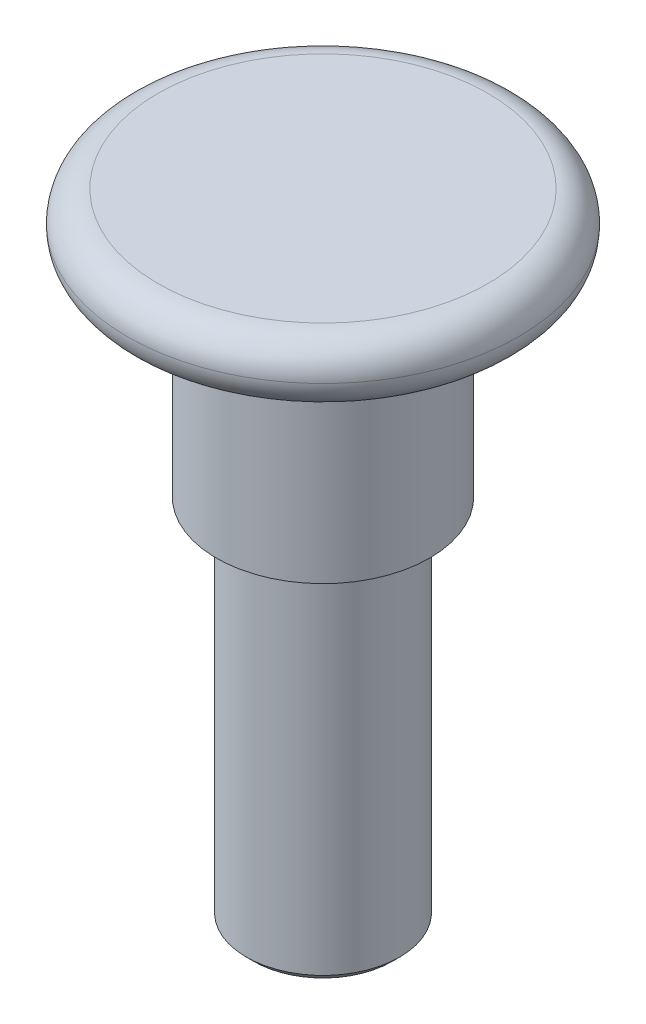
ISO-10303-21;
HEADER;
FILE_DESCRIPTION(('STEP AP214'),'2;1');
FILE_NAME('part.step','',(''),(''),'','','');
FILE_SCHEMA(('AUTOMOTIVE_DESIGN { 1 0 10303 214 1 1 1 1 }'));
ENDSEC;
DATA;
#1=APPLICATION_CONTEXT('core data for automotive mechanical design processes');
#2=APPLICATION_PROTOCOL_DEFINITION('international standard','automotive_design',2000,#1);
#3=PRODUCT_CONTEXT('',#1,'mechanical');
#4=PRODUCT('Part','Part','',(#3));
#5=PRODUCT_RELATED_PRODUCT_CATEGORY('part','',(#4));
#6=PRODUCT_DEFINITION_FORMATION('','',#4);
#7=PRODUCT_DEFINITION_CONTEXT('part definition',#1,'design');
#8=PRODUCT_DEFINITION('design','',#6,#7);
#9=PRODUCT_DEFINITION_SHAPE('','',#8);
#10=(LENGTH_UNIT() NAMED_UNIT(*) SI_UNIT(.MILLI.,.METRE.));
#11=(NAMED_UNIT(*) PLANE_ANGLE_UNIT() SI_UNIT($,.RADIAN.));
#12=(NAMED_UNIT(*) SI_UNIT($,.STERADIAN.) SOLID_ANGLE_UNIT());
#13=UNCERTAINTY_MEASURE_WITH_UNIT(LENGTH_MEASURE(1.E-05),#10,'distance_accuracy_value','');
#14=(GEOMETRIC_REPRESENTATION_CONTEXT(3) GLOBAL_UNCERTAINTY_ASSIGNED_CONTEXT((#13)) GLOBAL_UNIT_ASSIGNED_CONTEXT((#10,
#11,#12)) REPRESENTATION_CONTEXT('',''));
#15=CARTESIAN_POINT('',(0.,0.,0.));
#16=DIRECTION('',(0.,0.,1.));
#17=DIRECTION('',(1.,0.,0.));
#18=AXIS2_PLACEMENT_3D('',#15,#16,#17);
#19=CARTESIAN_POINT('',(0.,61.8362126245847,0.));
#20=DIRECTION('',(0.,1.,0.));
#21=DIRECTION('',(-1.,0.,0.));
#22=AXIS2_PLACEMENT_3D('',#19,#20,#21);
#23=PLANE('',#22);
#24=CARTESIAN_POINT('',(0.,61.8362126245847,0.));
#25=DIRECTION('',(0.,1.,0.));
#26=DIRECTION('',(-1.,0.,0.));
#27=AXIS2_PLACEMENT_3D('',#24,#25,#26);
#28=CIRCLE('',#27,10.75);
#29=CARTESIAN_POINT('',(-10.75,61.8362126245847,0.));
#30=VERTEX_POINT('',#29);
#31=EDGE_CURVE('E85',#30,#30,#28,.T.);
#32=ORIENTED_EDGE('',*,*,#31,.T.);
#33=EDGE_LOOP('',(#32));
#34=FACE_BOUND('',#33,.T.);
#35=ADVANCED_FACE('F33',(#34),#23,.T.);
#36=CARTESIAN_POINT('',(6.94999999999998,57.8362126245847,0.));
#37=DIRECTION('',(0.,-1.,0.));
#38=DIRECTION('',(1.,0.,0.));
#39=AXIS2_PLACEMENT_3D('',#36,#37,#38);
#40=PLANE('',#39);
#41=CARTESIAN_POINT('',(0.,57.8362126245847,0.));
#42=DIRECTION('',(0.,-1.,0.));
#43=DIRECTION('',(1.,0.,0.));
#44=AXIS2_PLACEMENT_3D('',#41,#42,#43);
#45=CIRCLE('',#44,10.75);
#46=CARTESIAN_POINT('',(10.75,57.8362126245847,0.));
#47=VERTEX_POINT('',#46);
#48=EDGE_CURVE('E84',#47,#47,#45,.T.);
#49=ORIENTED_EDGE('',*,*,#48,.T.);
#50=EDGE_LOOP('',(#49));
#51=FACE_BOUND('',#50,.T.);
#52=CARTESIAN_POINT('',(0.,57.8362126245847,0.));
#53=DIRECTION('',(0.,-1.,0.));
#54=DIRECTION('',(1.,0.,0.));
#55=AXIS2_PLACEMENT_3D('',#52,#53,#54);
#56=CIRCLE('',#55,6.94999999999998);
#57=CARTESIAN_POINT('',(6.94999999999998,57.8362126245847,0.));
#58=VERTEX_POINT('',#57);
#59=EDGE_CURVE('E86',#58,#58,#56,.T.);
#60=ORIENTED_EDGE('',*,*,#59,.F.);
#61=EDGE_LOOP('',(#60));
#62=FACE_BOUND('',#61,.T.);
#63=ADVANCED_FACE('F60',(#51,#62),#40,.T.);
#64=CARTESIAN_POINT('',(0.,-52.7197674418605,0.));
#65=DIRECTION('',(0.,-1.,0.));
#66=DIRECTION('',(1.,0.,0.));
#67=AXIS2_PLACEMENT_3D('',#64,#65,#66);
#68=CYLINDRICAL_SURFACE('',#67,6.94999999999998);
#69=ORIENTED_EDGE('',*,*,#59,.T.);
#70=EDGE_LOOP('',(#69));
#71=FACE_BOUND('',#70,.T.);
#72=CARTESIAN_POINT('',(0.,44.4362126245847,0.));
#73=DIRECTION('',(0.,-1.,0.));
#74=DIRECTION('',(1.,0.,0.));
#75=AXIS2_PLACEMENT_3D('',#72,#73,#74);
#76=CIRCLE('',#75,6.94999999999998);
#77=CARTESIAN_POINT('',(6.94999999999998,44.4362126245847,0.));
#78=VERTEX_POINT('',#77);
#79=EDGE_CURVE('E90',#78,#78,#76,.T.);
#80=ORIENTED_EDGE('',*,*,#79,.F.);
#81=EDGE_LOOP('',(#80));
#82=FACE_BOUND('',#81,.T.);
#83=ADVANCED_FACE('F66',(#71,#82),#68,.T.);
#84=CARTESIAN_POINT('',(6.94999999999998,44.4362126245847,0.));
#85=DIRECTION('',(0.,-1.,0.));
#86=DIRECTION('',(1.,0.,0.));
#87=AXIS2_PLACEMENT_3D('',#84,#85,#86);
#88=PLANE('',#87);
#89=ORIENTED_EDGE('',*,*,#79,.T.);
#90=EDGE_LOOP('',(#89));
#91=FACE_BOUND('',#90,.T.);
#92=CARTESIAN_POINT('',(0.,44.4362126245847,0.));
#93=DIRECTION('',(0.,-1.,0.));
#94=DIRECTION('',(1.,0.,0.));
#95=AXIS2_PLACEMENT_3D('',#92,#93,#94);
#96=CIRCLE('',#95,4.99999999999996);
#97=CARTESIAN_POINT('',(4.99999999999996,44.4362126245847,0.));
#98=VERTEX_POINT('',#97);
#99=EDGE_CURVE('E106',#98,#98,#96,.T.);
#100=ORIENTED_EDGE('',*,*,#99,.F.);
#101=EDGE_LOOP('',(#100));
#102=FACE_BOUND('',#101,.T.);
#103=ADVANCED_FACE('F114',(#91,#102),#88,.T.);
#104=CARTESIAN_POINT('',(0.,-52.7197674418605,0.));
#105=DIRECTION('',(0.,-1.,0.));
#106=DIRECTION('',(1.,0.,0.));
#107=AXIS2_PLACEMENT_3D('',#104,#105,#106);
#108=CYLINDRICAL_SURFACE('',#107,4.99999999999997);
#109=CARTESIAN_POINT('',(0.,20.9362126245847,0.));
#110=DIRECTION('',(0.,-1.,0.));
#111=DIRECTION('',(1.,0.,0.));
#112=AXIS2_PLACEMENT_3D('',#109,#110,#111);
#113=CIRCLE('',#112,4.99999999999997);
#114=CARTESIAN_POINT('',(4.99999999999997,20.9362126245847,0.));
#115=VERTEX_POINT('',#114);
#116=EDGE_CURVE('E11',#115,#115,#113,.F.);
#117=ORIENTED_EDGE('',*,*,#116,.T.);
#118=EDGE_LOOP('',(#117));
#119=FACE_BOUND('',#118,.T.);
#120=ORIENTED_EDGE('',*,*,#99,.T.);
#121=EDGE_LOOP('',(#120));
#122=FACE_BOUND('',#121,.T.);
#123=ADVANCED_FACE('F101',(#119,#122),#108,.T.);
#124=CARTESIAN_POINT('',(4.99999999999997,20.4362126245847,0.));
#125=DIRECTION('',(0.,-1.,0.));
#126=DIRECTION('',(1.,0.,0.));
#127=AXIS2_PLACEMENT_3D('',#124,#125,#126);
#128=PLANE('',#127);
#129=CARTESIAN_POINT('',(0.,20.4362126245847,0.));
#130=DIRECTION('',(0.,-1.,0.));
#131=DIRECTION('',(1.,0.,0.));
#132=AXIS2_PLACEMENT_3D('',#129,#130,#131);
#133=CIRCLE('',#132,4.49999999999996);
#134=CARTESIAN_POINT('',(4.49999999999996,20.4362126245847,0.));
#135=VERTEX_POINT('',#134);
#136=EDGE_CURVE('E40',#135,#135,#133,.T.);
#137=ORIENTED_EDGE('',*,*,#136,.T.);
#138=EDGE_LOOP('',(#137));
#139=FACE_BOUND('',#138,.T.);
#140=CARTESIAN_POINT('',(0.,20.4362126245847,0.));
#141=DIRECTION('',(0.,-1.,0.));
#142=DIRECTION('',(1.,0.,0.));
#143=AXIS2_PLACEMENT_3D('',#140,#141,#142);
#144=CIRCLE('',#143,1.99999999999999);
#145=CARTESIAN_POINT('',(1.99999999999999,20.4362126245847,0.));
#146=VERTEX_POINT('',#145);
#147=EDGE_CURVE('E105',#146,#146,#144,.T.);
#148=ORIENTED_EDGE('',*,*,#147,.F.);
#149=EDGE_LOOP('',(#148));
#150=FACE_BOUND('',#149,.T.);
#151=ADVANCED_FACE('F55',(#139,#150),#128,.T.);
#152=CARTESIAN_POINT('',(0.,-52.7197674418605,0.));
#153=DIRECTION('',(0.,-1.,0.));
#154=DIRECTION('',(1.,0.,0.));
#155=AXIS2_PLACEMENT_3D('',#152,#153,#154);
#156=CYLINDRICAL_SURFACE('',#155,1.99999999999999);
#157=ORIENTED_EDGE('',*,*,#147,.T.);
#158=EDGE_LOOP('',(#157));
#159=FACE_BOUND('',#158,.T.);
#160=CARTESIAN_POINT('',(0.,29.4362126245847,0.));
#161=DIRECTION('',(0.,-1.,0.));
#162=DIRECTION('',(1.,0.,0.));
#163=AXIS2_PLACEMENT_3D('',#160,#161,#162);
#164=CIRCLE('',#163,1.99999999999999);
#165=CARTESIAN_POINT('',(1.99999999999999,29.4362126245847,0.));
#166=VERTEX_POINT('',#165);
#167=EDGE_CURVE('E94',#166,#166,#164,.T.);
#168=ORIENTED_EDGE('',*,*,#167,.F.);
#169=EDGE_LOOP('',(#168));
#170=FACE_BOUND('',#169,.T.);
#171=ADVANCED_FACE('F46',(#159,#170),#156,.F.);
#172=CARTESIAN_POINT('',(0.,30.6862126245847,0.));
#173=DIRECTION('',(0.,-1.,0.));
#174=DIRECTION('',(1.,0.,0.));
#175=AXIS2_PLACEMENT_3D('',#172,#173,#174);
#176=CONICAL_SURFACE('',#175,0.,1.01219701145133);
#177=ORIENTED_EDGE('',*,*,#167,.T.);
#178=EDGE_LOOP('',(#177));
#179=FACE_BOUND('',#178,.T.);
#180=CARTESIAN_POINT('',(0.,30.6862126245847,0.));
#181=VERTEX_POINT('',#180);
#182=VERTEX_LOOP('',#181);
#183=FACE_BOUND('',#182,.T.);
#184=ADVANCED_FACE('F43',(#179,#183),#176,.F.);
#185=CARTESIAN_POINT('',(0.,59.8362126245847,0.));
#186=DIRECTION('',(0.,1.,0.));
#187=DIRECTION('',(-1.,0.,0.));
#188=AXIS2_PLACEMENT_3D('',#185,#186,#187);
#189=TOROIDAL_SURFACE('',#188,10.75,2.);
#190=ORIENTED_EDGE('',*,*,#31,.F.);
#191=EDGE_LOOP('',(#190));
#192=FACE_BOUND('',#191,.T.);
#193=CARTESIAN_POINT('',(0.,59.8362126245847,0.));
#194=DIRECTION('',(0.,1.,0.));
#195=DIRECTION('',(-1.,0.,0.));
#196=AXIS2_PLACEMENT_3D('',#193,#194,#195);
#197=CIRCLE('',#196,12.75);
#198=CARTESIAN_POINT('',(-12.75,59.8362126245847,0.));
#199=VERTEX_POINT('',#198);
#200=EDGE_CURVE('E81',#199,#199,#197,.F.);
#201=ORIENTED_EDGE('',*,*,#200,.F.);
#202=EDGE_LOOP('',(#201));
#203=FACE_BOUND('',#202,.T.);
#204=ADVANCED_FACE('F45',(#192,#203),#189,.T.);
#205=CARTESIAN_POINT('',(0.,59.8362126245847,0.));
#206=DIRECTION('',(0.,-1.,0.));
#207=DIRECTION('',(1.,0.,0.));
#208=AXIS2_PLACEMENT_3D('',#205,#206,#207);
#209=TOROIDAL_SURFACE('',#208,10.75,2.);
#210=ORIENTED_EDGE('',*,*,#200,.T.);
#211=EDGE_LOOP('',(#210));
#212=FACE_BOUND('',#211,.T.);
#213=ORIENTED_EDGE('',*,*,#48,.F.);
#214=EDGE_LOOP('',(#213));
#215=FACE_BOUND('',#214,.T.);
#216=ADVANCED_FACE('F53',(#212,#215),#209,.T.);
#217=CARTESIAN_POINT('',(0.,20.4362126245847,0.));
#218=DIRECTION('',(0.,1.,0.));
#219=DIRECTION('',(-1.,0.,0.));
#220=AXIS2_PLACEMENT_3D('',#217,#218,#219);
#221=CONICAL_SURFACE('',#220,4.49999999999996,0.785398163397438);
#222=ORIENTED_EDGE('',*,*,#116,.F.);
#223=EDGE_LOOP('',(#222));
#224=FACE_BOUND('',#223,.T.);
#225=ORIENTED_EDGE('',*,*,#136,.F.);
#226=EDGE_LOOP('',(#225));
#227=FACE_BOUND('',#226,.T.);
#228=ADVANCED_FACE('F35',(#224,#227),#221,.T.);
#229=CLOSED_SHELL('',(#35,#63,#83,#103,#123,#151,#171,#184,#204,#216,#228));
#230=MANIFOLD_SOLID_BREP('B2',#229);
#231=ADVANCED_BREP_SHAPE_REPRESENTATION('',(#18,#230),#14);
#232=SHAPE_DEFINITION_REPRESENTATION(#9,#231);
ENDSEC;
END-ISO-10303-21;
